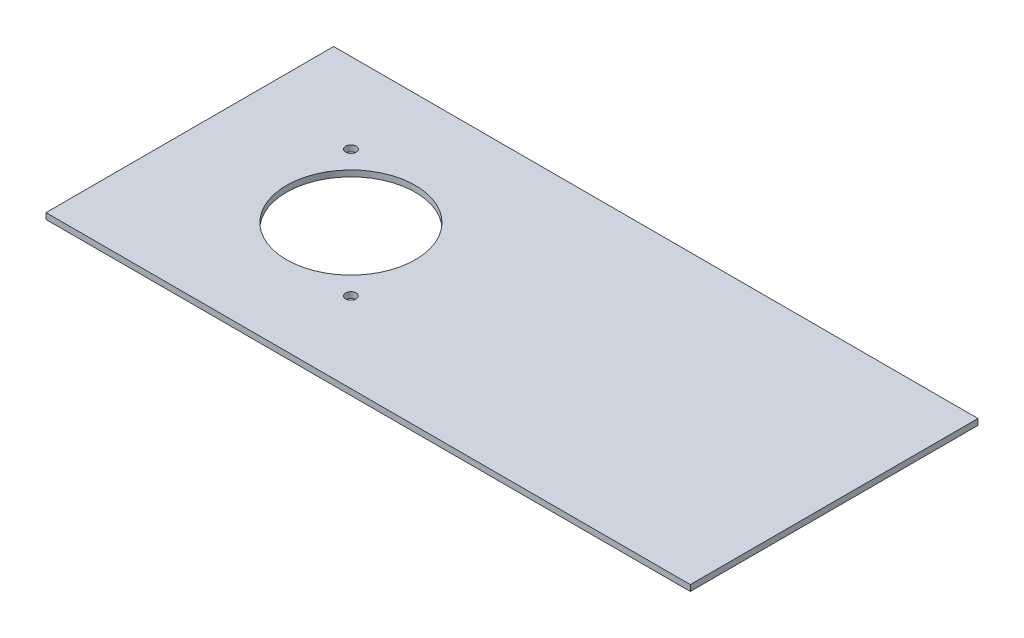
ISO-10303-21;
HEADER;
FILE_DESCRIPTION(('STEP AP214'),'2;1');
FILE_NAME('part.step','',(''),(''),'','','');
FILE_SCHEMA(('AUTOMOTIVE_DESIGN { 1 0 10303 214 1 1 1 1 }'));
ENDSEC;
DATA;
#1=APPLICATION_CONTEXT('core data for automotive mechanical design processes');
#2=APPLICATION_PROTOCOL_DEFINITION('international standard','automotive_design',2000,#1);
#3=PRODUCT_CONTEXT('',#1,'mechanical');
#4=PRODUCT('Part','Part','',(#3));
#5=PRODUCT_RELATED_PRODUCT_CATEGORY('part','',(#4));
#6=PRODUCT_DEFINITION_FORMATION('','',#4);
#7=PRODUCT_DEFINITION_CONTEXT('part definition',#1,'design');
#8=PRODUCT_DEFINITION('design','',#6,#7);
#9=PRODUCT_DEFINITION_SHAPE('','',#8);
#10=(LENGTH_UNIT() NAMED_UNIT(*) SI_UNIT(.MILLI.,.METRE.));
#11=(NAMED_UNIT(*) PLANE_ANGLE_UNIT() SI_UNIT($,.RADIAN.));
#12=(NAMED_UNIT(*) SI_UNIT($,.STERADIAN.) SOLID_ANGLE_UNIT());
#13=UNCERTAINTY_MEASURE_WITH_UNIT(LENGTH_MEASURE(1.E-05),#10,'distance_accuracy_value','');
#14=(GEOMETRIC_REPRESENTATION_CONTEXT(3) GLOBAL_UNCERTAINTY_ASSIGNED_CONTEXT((#13)) GLOBAL_UNIT_ASSIGNED_CONTEXT((#10,
#11,#12)) REPRESENTATION_CONTEXT('',''));
#15=CARTESIAN_POINT('',(0.,0.,0.));
#16=DIRECTION('',(0.,0.,1.));
#17=DIRECTION('',(1.,0.,0.));
#18=AXIS2_PLACEMENT_3D('',#15,#16,#17);
#19=CARTESIAN_POINT('',(0.,2.,0.));
#20=DIRECTION('',(0.,1.,0.));
#21=DIRECTION('',(0.,0.,1.));
#22=AXIS2_PLACEMENT_3D('',#19,#20,#21);
#23=PLANE('',#22);
#24=CARTESIAN_POINT('',(-32.5367965644034,2.,21.2132034355963));
#25=DIRECTION('',(0.,1.,0.));
#26=DIRECTION('',(0.,0.,1.));
#27=AXIS2_PLACEMENT_3D('',#24,#25,#26);
#28=CIRCLE('',#27,1.74999999999994);
#29=CARTESIAN_POINT('',(-32.5367965644034,2.,22.9632034355962));
#30=VERTEX_POINT('',#29);
#31=EDGE_CURVE('E123',#30,#30,#28,.T.);
#32=ORIENTED_EDGE('',*,*,#31,.F.);
#33=EDGE_LOOP('',(#32));
#34=FACE_BOUND('',#33,.T.);
#35=DIRECTION('',(0.,0.,1.));
#36=VECTOR('',#35,1.);
#37=CARTESIAN_POINT('',(-107.5,2.,48.));
#38=LINE('',#37,#36);
#39=CARTESIAN_POINT('',(-107.5,2.,-48.));
#40=VERTEX_POINT('',#39);
#41=CARTESIAN_POINT('',(-107.5,2.,48.));
#42=VERTEX_POINT('',#41);
#43=EDGE_CURVE('E93',#40,#42,#38,.T.);
#44=ORIENTED_EDGE('',*,*,#43,.T.);
#45=DIRECTION('',(1.,0.,0.));
#46=VECTOR('',#45,1.);
#47=CARTESIAN_POINT('',(107.5,2.,48.));
#48=LINE('',#47,#46);
#49=CARTESIAN_POINT('',(107.5,2.,48.));
#50=VERTEX_POINT('',#49);
#51=EDGE_CURVE('E88',#42,#50,#48,.T.);
#52=ORIENTED_EDGE('',*,*,#51,.T.);
#53=DIRECTION('',(0.,0.,-1.));
#54=VECTOR('',#53,1.);
#55=CARTESIAN_POINT('',(107.5,2.,48.));
#56=LINE('',#55,#54);
#57=CARTESIAN_POINT('',(107.5,2.,-48.));
#58=VERTEX_POINT('',#57);
#59=EDGE_CURVE('E90',#50,#58,#56,.T.);
#60=ORIENTED_EDGE('',*,*,#59,.T.);
#61=DIRECTION('',(-1.,0.,0.));
#62=VECTOR('',#61,1.);
#63=CARTESIAN_POINT('',(107.5,2.,-48.));
#64=LINE('',#63,#62);
#65=EDGE_CURVE('E57',#58,#40,#64,.T.);
#66=ORIENTED_EDGE('',*,*,#65,.T.);
#67=EDGE_LOOP('',(#44,#52,#60,#66));
#68=FACE_BOUND('',#67,.T.);
#69=CARTESIAN_POINT('',(-74.9632034355966,2.,-21.2132034355963));
#70=DIRECTION('',(0.,1.,0.));
#71=DIRECTION('',(0.,0.,1.));
#72=AXIS2_PLACEMENT_3D('',#69,#70,#71);
#73=CIRCLE('',#72,1.74999999999996);
#74=CARTESIAN_POINT('',(-74.9632034355966,2.,-19.4632034355963));
#75=VERTEX_POINT('',#74);
#76=EDGE_CURVE('E106',#75,#75,#73,.T.);
#77=ORIENTED_EDGE('',*,*,#76,.F.);
#78=EDGE_LOOP('',(#77));
#79=FACE_BOUND('',#78,.T.);
#80=CARTESIAN_POINT('',(-53.75,2.,0.));
#81=DIRECTION('',(0.,1.,0.));
#82=DIRECTION('',(0.,0.,1.));
#83=AXIS2_PLACEMENT_3D('',#80,#81,#82);
#84=CIRCLE('',#83,21.5);
#85=CARTESIAN_POINT('',(-53.75,2.,21.5));
#86=VERTEX_POINT('',#85);
#87=EDGE_CURVE('E130',#86,#86,#84,.T.);
#88=ORIENTED_EDGE('',*,*,#87,.F.);
#89=EDGE_LOOP('',(#88));
#90=FACE_BOUND('',#89,.T.);
#91=ADVANCED_FACE('F39',(#34,#68,#79,#90),#23,.T.);
#92=CARTESIAN_POINT('',(0.,0.,0.));
#93=DIRECTION('',(0.,1.,0.));
#94=DIRECTION('',(0.,0.,1.));
#95=AXIS2_PLACEMENT_3D('',#92,#93,#94);
#96=PLANE('',#95);
#97=DIRECTION('',(0.,0.,1.));
#98=VECTOR('',#97,1.);
#99=CARTESIAN_POINT('',(-107.5,0.,48.));
#100=LINE('',#99,#98);
#101=CARTESIAN_POINT('',(-107.5,0.,-48.));
#102=VERTEX_POINT('',#101);
#103=CARTESIAN_POINT('',(-107.5,0.,48.));
#104=VERTEX_POINT('',#103);
#105=EDGE_CURVE('E103',#102,#104,#100,.T.);
#106=ORIENTED_EDGE('',*,*,#105,.F.);
#107=DIRECTION('',(-1.,0.,0.));
#108=VECTOR('',#107,1.);
#109=CARTESIAN_POINT('',(107.5,0.,-48.));
#110=LINE('',#109,#108);
#111=CARTESIAN_POINT('',(107.5,0.,-48.));
#112=VERTEX_POINT('',#111);
#113=EDGE_CURVE('E76',#112,#102,#110,.T.);
#114=ORIENTED_EDGE('',*,*,#113,.F.);
#115=DIRECTION('',(0.,0.,-1.));
#116=VECTOR('',#115,1.);
#117=CARTESIAN_POINT('',(107.5,0.,48.));
#118=LINE('',#117,#116);
#119=CARTESIAN_POINT('',(107.5,0.,48.));
#120=VERTEX_POINT('',#119);
#121=EDGE_CURVE('E71',#120,#112,#118,.T.);
#122=ORIENTED_EDGE('',*,*,#121,.F.);
#123=DIRECTION('',(1.,0.,0.));
#124=VECTOR('',#123,1.);
#125=CARTESIAN_POINT('',(107.5,0.,48.));
#126=LINE('',#125,#124);
#127=EDGE_CURVE('E92',#104,#120,#126,.T.);
#128=ORIENTED_EDGE('',*,*,#127,.F.);
#129=EDGE_LOOP('',(#106,#114,#122,#128));
#130=FACE_BOUND('',#129,.T.);
#131=CARTESIAN_POINT('',(-74.9632034355966,0.,-21.2132034355963));
#132=DIRECTION('',(0.,1.,0.));
#133=DIRECTION('',(0.,0.,1.));
#134=AXIS2_PLACEMENT_3D('',#131,#132,#133);
#135=CIRCLE('',#134,1.74999999999996);
#136=CARTESIAN_POINT('',(-74.9632034355966,0.,-19.4632034355963));
#137=VERTEX_POINT('',#136);
#138=EDGE_CURVE('E119',#137,#137,#135,.T.);
#139=ORIENTED_EDGE('',*,*,#138,.T.);
#140=EDGE_LOOP('',(#139));
#141=FACE_BOUND('',#140,.T.);
#142=CARTESIAN_POINT('',(-32.5367965644034,0.,21.2132034355963));
#143=DIRECTION('',(0.,1.,0.));
#144=DIRECTION('',(0.,0.,1.));
#145=AXIS2_PLACEMENT_3D('',#142,#143,#144);
#146=CIRCLE('',#145,1.74999999999994);
#147=CARTESIAN_POINT('',(-32.5367965644034,0.,22.9632034355962));
#148=VERTEX_POINT('',#147);
#149=EDGE_CURVE('E122',#148,#148,#146,.T.);
#150=ORIENTED_EDGE('',*,*,#149,.T.);
#151=EDGE_LOOP('',(#150));
#152=FACE_BOUND('',#151,.T.);
#153=CARTESIAN_POINT('',(-53.75,0.,0.));
#154=DIRECTION('',(0.,1.,0.));
#155=DIRECTION('',(0.,0.,1.));
#156=AXIS2_PLACEMENT_3D('',#153,#154,#155);
#157=CIRCLE('',#156,21.5);
#158=CARTESIAN_POINT('',(-53.75,0.,21.5));
#159=VERTEX_POINT('',#158);
#160=EDGE_CURVE('E128',#159,#159,#157,.T.);
#161=ORIENTED_EDGE('',*,*,#160,.T.);
#162=EDGE_LOOP('',(#161));
#163=FACE_BOUND('',#162,.T.);
#164=ADVANCED_FACE('F111',(#130,#141,#152,#163),#96,.F.);
#165=CARTESIAN_POINT('',(-107.5,2.,48.));
#166=DIRECTION('',(1.,0.,0.));
#167=DIRECTION('',(0.,0.,-1.));
#168=AXIS2_PLACEMENT_3D('',#165,#166,#167);
#169=PLANE('',#168);
#170=ORIENTED_EDGE('',*,*,#105,.T.);
#171=DIRECTION('',(0.,-1.,0.));
#172=VECTOR('',#171,1.);
#173=CARTESIAN_POINT('',(-107.5,2.,48.));
#174=LINE('',#173,#172);
#175=EDGE_CURVE('E11',#42,#104,#174,.T.);
#176=ORIENTED_EDGE('',*,*,#175,.F.);
#177=ORIENTED_EDGE('',*,*,#43,.F.);
#178=DIRECTION('',(0.,-1.,0.));
#179=VECTOR('',#178,1.);
#180=CARTESIAN_POINT('',(-107.5,2.,-48.));
#181=LINE('',#180,#179);
#182=EDGE_CURVE('E97',#40,#102,#181,.T.);
#183=ORIENTED_EDGE('',*,*,#182,.T.);
#184=EDGE_LOOP('',(#170,#176,#177,#183));
#185=FACE_BOUND('',#184,.T.);
#186=ADVANCED_FACE('F41',(#185),#169,.F.);
#187=CARTESIAN_POINT('',(107.5,2.,48.));
#188=DIRECTION('',(0.,0.,-1.));
#189=DIRECTION('',(-1.,0.,0.));
#190=AXIS2_PLACEMENT_3D('',#187,#188,#189);
#191=PLANE('',#190);
#192=ORIENTED_EDGE('',*,*,#127,.T.);
#193=DIRECTION('',(0.,-1.,0.));
#194=VECTOR('',#193,1.);
#195=CARTESIAN_POINT('',(107.5,2.,48.));
#196=LINE('',#195,#194);
#197=EDGE_CURVE('E48',#50,#120,#196,.T.);
#198=ORIENTED_EDGE('',*,*,#197,.F.);
#199=ORIENTED_EDGE('',*,*,#51,.F.);
#200=ORIENTED_EDGE('',*,*,#175,.T.);
#201=EDGE_LOOP('',(#192,#198,#199,#200));
#202=FACE_BOUND('',#201,.T.);
#203=ADVANCED_FACE('F94',(#202),#191,.F.);
#204=CARTESIAN_POINT('',(107.5,2.,48.));
#205=DIRECTION('',(-1.,0.,0.));
#206=DIRECTION('',(0.,0.,1.));
#207=AXIS2_PLACEMENT_3D('',#204,#205,#206);
#208=PLANE('',#207);
#209=ORIENTED_EDGE('',*,*,#121,.T.);
#210=DIRECTION('',(0.,-1.,0.));
#211=VECTOR('',#210,1.);
#212=CARTESIAN_POINT('',(107.5,2.,-48.));
#213=LINE('',#212,#211);
#214=EDGE_CURVE('E96',#58,#112,#213,.T.);
#215=ORIENTED_EDGE('',*,*,#214,.F.);
#216=ORIENTED_EDGE('',*,*,#59,.F.);
#217=ORIENTED_EDGE('',*,*,#197,.T.);
#218=EDGE_LOOP('',(#209,#215,#216,#217));
#219=FACE_BOUND('',#218,.T.);
#220=ADVANCED_FACE('F100',(#219),#208,.F.);
#221=CARTESIAN_POINT('',(107.5,2.,-48.));
#222=DIRECTION('',(0.,0.,1.));
#223=DIRECTION('',(1.,0.,0.));
#224=AXIS2_PLACEMENT_3D('',#221,#222,#223);
#225=PLANE('',#224);
#226=ORIENTED_EDGE('',*,*,#113,.T.);
#227=ORIENTED_EDGE('',*,*,#182,.F.);
#228=ORIENTED_EDGE('',*,*,#65,.F.);
#229=ORIENTED_EDGE('',*,*,#214,.T.);
#230=EDGE_LOOP('',(#226,#227,#228,#229));
#231=FACE_BOUND('',#230,.T.);
#232=ADVANCED_FACE('F112',(#231),#225,.F.);
#233=CARTESIAN_POINT('',(-74.9632034355966,2.,-21.2132034355963));
#234=DIRECTION('',(0.,-1.,0.));
#235=DIRECTION('',(0.,0.,-1.));
#236=AXIS2_PLACEMENT_3D('',#233,#234,#235);
#237=CYLINDRICAL_SURFACE('',#236,1.74999999999996);
#238=ORIENTED_EDGE('',*,*,#76,.T.);
#239=EDGE_LOOP('',(#238));
#240=FACE_BOUND('',#239,.T.);
#241=ORIENTED_EDGE('',*,*,#138,.F.);
#242=EDGE_LOOP('',(#241));
#243=FACE_BOUND('',#242,.T.);
#244=ADVANCED_FACE('F146',(#240,#243),#237,.F.);
#245=CARTESIAN_POINT('',(-32.5367965644034,2.,21.2132034355963));
#246=DIRECTION('',(0.,-1.,0.));
#247=DIRECTION('',(0.,0.,-1.));
#248=AXIS2_PLACEMENT_3D('',#245,#246,#247);
#249=CYLINDRICAL_SURFACE('',#248,1.74999999999994);
#250=ORIENTED_EDGE('',*,*,#31,.T.);
#251=EDGE_LOOP('',(#250));
#252=FACE_BOUND('',#251,.T.);
#253=ORIENTED_EDGE('',*,*,#149,.F.);
#254=EDGE_LOOP('',(#253));
#255=FACE_BOUND('',#254,.T.);
#256=ADVANCED_FACE('F191',(#252,#255),#249,.F.);
#257=CARTESIAN_POINT('',(-53.75,2.,0.));
#258=DIRECTION('',(0.,-1.,0.));
#259=DIRECTION('',(0.,0.,-1.));
#260=AXIS2_PLACEMENT_3D('',#257,#258,#259);
#261=CYLINDRICAL_SURFACE('',#260,21.5);
#262=ORIENTED_EDGE('',*,*,#87,.T.);
#263=EDGE_LOOP('',(#262));
#264=FACE_BOUND('',#263,.T.);
#265=ORIENTED_EDGE('',*,*,#160,.F.);
#266=EDGE_LOOP('',(#265));
#267=FACE_BOUND('',#266,.T.);
#268=ADVANCED_FACE('F138',(#264,#267),#261,.F.);
#269=CLOSED_SHELL('',(#91,#164,#186,#203,#220,#232,#244,#256,#268));
#270=MANIFOLD_SOLID_BREP('B2',#269);
#271=ADVANCED_BREP_SHAPE_REPRESENTATION('',(#18,#270),#14);
#272=SHAPE_DEFINITION_REPRESENTATION(#9,#271);
ENDSEC;
END-ISO-10303-21;
